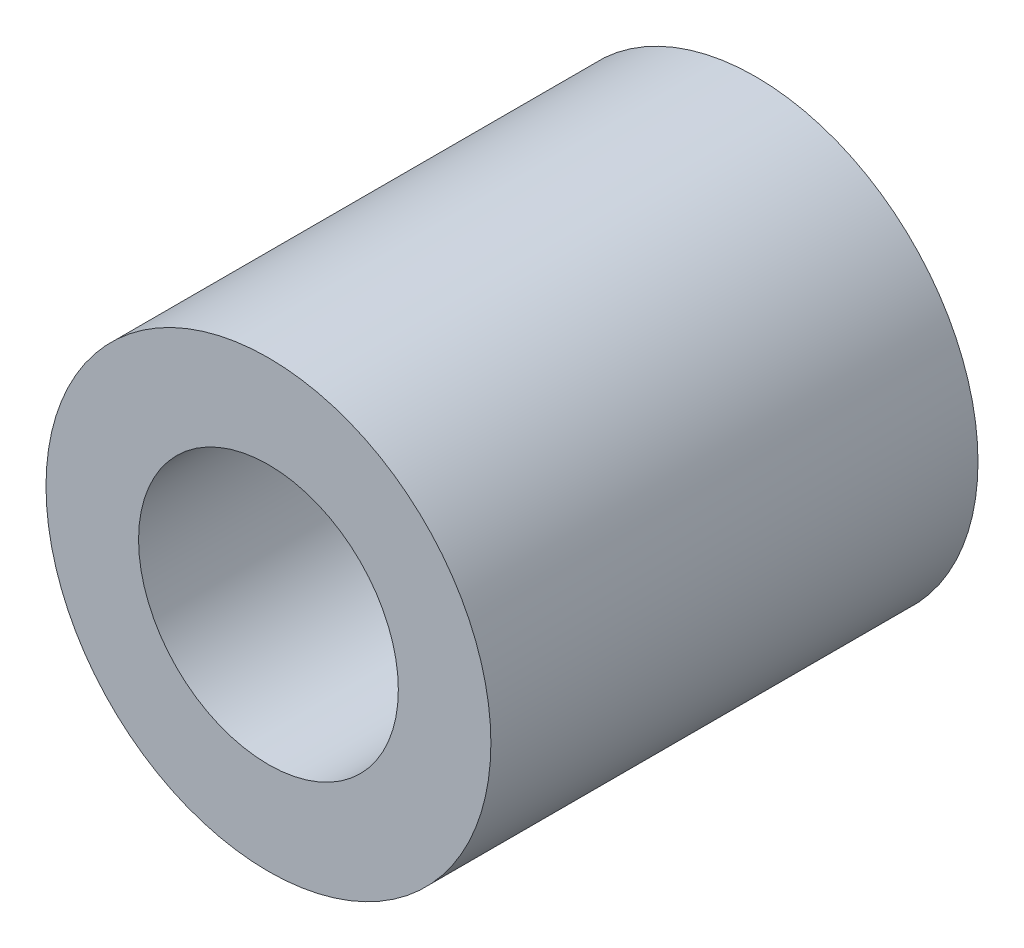
ISO-10303-21;
HEADER;
FILE_DESCRIPTION(('STEP AP214'),'2;1');
FILE_NAME('part.step','',(''),(''),'','','');
FILE_SCHEMA(('AUTOMOTIVE_DESIGN { 1 0 10303 214 1 1 1 1 }'));
ENDSEC;
DATA;
#1=APPLICATION_CONTEXT('core data for automotive mechanical design processes');
#2=APPLICATION_PROTOCOL_DEFINITION('international standard','automotive_design',2000,#1);
#3=PRODUCT_CONTEXT('',#1,'mechanical');
#4=PRODUCT('Part','Part','',(#3));
#5=PRODUCT_RELATED_PRODUCT_CATEGORY('part','',(#4));
#6=PRODUCT_DEFINITION_FORMATION('','',#4);
#7=PRODUCT_DEFINITION_CONTEXT('part definition',#1,'design');
#8=PRODUCT_DEFINITION('design','',#6,#7);
#9=PRODUCT_DEFINITION_SHAPE('','',#8);
#10=(LENGTH_UNIT() NAMED_UNIT(*) SI_UNIT(.MILLI.,.METRE.));
#11=(NAMED_UNIT(*) PLANE_ANGLE_UNIT() SI_UNIT($,.RADIAN.));
#12=(NAMED_UNIT(*) SI_UNIT($,.STERADIAN.) SOLID_ANGLE_UNIT());
#13=UNCERTAINTY_MEASURE_WITH_UNIT(LENGTH_MEASURE(1.E-05),#10,'distance_accuracy_value','');
#14=(GEOMETRIC_REPRESENTATION_CONTEXT(3) GLOBAL_UNCERTAINTY_ASSIGNED_CONTEXT((#13)) GLOBAL_UNIT_ASSIGNED_CONTEXT((#10,
#11,#12)) REPRESENTATION_CONTEXT('',''));
#15=CARTESIAN_POINT('',(0.,0.,0.));
#16=DIRECTION('',(0.,0.,1.));
#17=DIRECTION('',(1.,0.,0.));
#18=AXIS2_PLACEMENT_3D('',#15,#16,#17);
#19=CARTESIAN_POINT('',(0.,0.,15.));
#20=DIRECTION('',(0.,0.,1.));
#21=DIRECTION('',(1.,0.,0.));
#22=AXIS2_PLACEMENT_3D('',#19,#20,#21);
#23=PLANE('',#22);
#24=CARTESIAN_POINT('',(0.,0.,15.));
#25=DIRECTION('',(0.,0.,1.));
#26=DIRECTION('',(1.,0.,0.));
#27=AXIS2_PLACEMENT_3D('',#24,#25,#26);
#28=CIRCLE('',#27,6.85);
#29=CARTESIAN_POINT('',(6.85,0.,15.));
#30=VERTEX_POINT('',#29);
#31=EDGE_CURVE('E10',#30,#30,#28,.T.);
#32=ORIENTED_EDGE('',*,*,#31,.T.);
#33=EDGE_LOOP('',(#32));
#34=FACE_BOUND('',#33,.T.);
#35=CARTESIAN_POINT('',(0.,0.,15.));
#36=DIRECTION('',(0.,0.,1.));
#37=DIRECTION('',(1.,0.,0.));
#38=AXIS2_PLACEMENT_3D('',#35,#36,#37);
#39=CIRCLE('',#38,4.);
#40=CARTESIAN_POINT('',(4.,0.,15.));
#41=VERTEX_POINT('',#40);
#42=EDGE_CURVE('E43',#41,#41,#39,.T.);
#43=ORIENTED_EDGE('',*,*,#42,.F.);
#44=EDGE_LOOP('',(#43));
#45=FACE_BOUND('',#44,.T.);
#46=ADVANCED_FACE('F32',(#34,#45),#23,.T.);
#47=CARTESIAN_POINT('',(0.,0.,0.));
#48=DIRECTION('',(0.,0.,1.));
#49=DIRECTION('',(1.,0.,0.));
#50=AXIS2_PLACEMENT_3D('',#47,#48,#49);
#51=PLANE('',#50);
#52=CARTESIAN_POINT('',(0.,0.,0.));
#53=DIRECTION('',(0.,0.,1.));
#54=DIRECTION('',(1.,0.,0.));
#55=AXIS2_PLACEMENT_3D('',#52,#53,#54);
#56=CIRCLE('',#55,6.85);
#57=CARTESIAN_POINT('',(6.85,0.,0.));
#58=VERTEX_POINT('',#57);
#59=EDGE_CURVE('E36',#58,#58,#56,.T.);
#60=ORIENTED_EDGE('',*,*,#59,.F.);
#61=EDGE_LOOP('',(#60));
#62=FACE_BOUND('',#61,.T.);
#63=CARTESIAN_POINT('',(0.,0.,0.));
#64=DIRECTION('',(0.,0.,1.));
#65=DIRECTION('',(1.,0.,0.));
#66=AXIS2_PLACEMENT_3D('',#63,#64,#65);
#67=CIRCLE('',#66,4.);
#68=CARTESIAN_POINT('',(4.,0.,0.));
#69=VERTEX_POINT('',#68);
#70=EDGE_CURVE('E45',#69,#69,#67,.T.);
#71=ORIENTED_EDGE('',*,*,#70,.T.);
#72=EDGE_LOOP('',(#71));
#73=FACE_BOUND('',#72,.T.);
#74=ADVANCED_FACE('F55',(#62,#73),#51,.F.);
#75=CARTESIAN_POINT('',(0.,0.,15.));
#76=DIRECTION('',(0.,0.,-1.));
#77=DIRECTION('',(-1.,0.,0.));
#78=AXIS2_PLACEMENT_3D('',#75,#76,#77);
#79=CYLINDRICAL_SURFACE('',#78,6.85);
#80=ORIENTED_EDGE('',*,*,#31,.F.);
#81=EDGE_LOOP('',(#80));
#82=FACE_BOUND('',#81,.T.);
#83=ORIENTED_EDGE('',*,*,#59,.T.);
#84=EDGE_LOOP('',(#83));
#85=FACE_BOUND('',#84,.T.);
#86=ADVANCED_FACE('F34',(#82,#85),#79,.T.);
#87=CARTESIAN_POINT('',(0.,0.,15.));
#88=DIRECTION('',(0.,0.,-1.));
#89=DIRECTION('',(-1.,0.,0.));
#90=AXIS2_PLACEMENT_3D('',#87,#88,#89);
#91=CYLINDRICAL_SURFACE('',#90,4.);
#92=ORIENTED_EDGE('',*,*,#42,.T.);
#93=EDGE_LOOP('',(#92));
#94=FACE_BOUND('',#93,.T.);
#95=ORIENTED_EDGE('',*,*,#70,.F.);
#96=EDGE_LOOP('',(#95));
#97=FACE_BOUND('',#96,.T.);
#98=ADVANCED_FACE('F51',(#94,#97),#91,.F.);
#99=CLOSED_SHELL('',(#46,#74,#86,#98));
#100=MANIFOLD_SOLID_BREP('B2',#99);
#101=ADVANCED_BREP_SHAPE_REPRESENTATION('',(#18,#100),#14);
#102=SHAPE_DEFINITION_REPRESENTATION(#9,#101);
ENDSEC;
END-ISO-10303-21;
